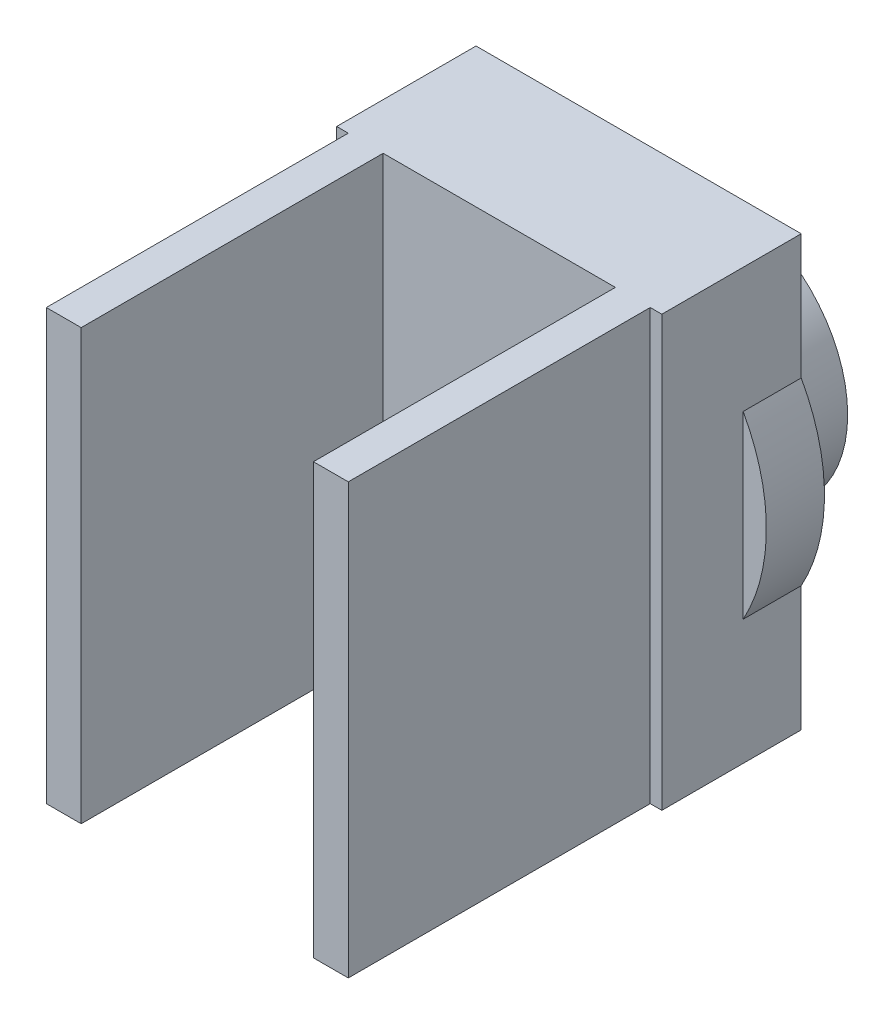
ISO-10303-21;
HEADER;
FILE_DESCRIPTION(('STEP AP214'),'2;1');
FILE_NAME('part.step','',(''),(''),'','','');
FILE_SCHEMA(('AUTOMOTIVE_DESIGN { 1 0 10303 214 1 1 1 1 }'));
ENDSEC;
DATA;
#1=APPLICATION_CONTEXT('core data for automotive mechanical design processes');
#2=APPLICATION_PROTOCOL_DEFINITION('international standard','automotive_design',2000,#1);
#3=PRODUCT_CONTEXT('',#1,'mechanical');
#4=PRODUCT('Part','Part','',(#3));
#5=PRODUCT_RELATED_PRODUCT_CATEGORY('part','',(#4));
#6=PRODUCT_DEFINITION_FORMATION('','',#4);
#7=PRODUCT_DEFINITION_CONTEXT('part definition',#1,'design');
#8=PRODUCT_DEFINITION('design','',#6,#7);
#9=PRODUCT_DEFINITION_SHAPE('','',#8);
#10=(LENGTH_UNIT() NAMED_UNIT(*) SI_UNIT(.MILLI.,.METRE.));
#11=(NAMED_UNIT(*) PLANE_ANGLE_UNIT() SI_UNIT($,.RADIAN.));
#12=(NAMED_UNIT(*) SI_UNIT($,.STERADIAN.) SOLID_ANGLE_UNIT());
#13=UNCERTAINTY_MEASURE_WITH_UNIT(LENGTH_MEASURE(1.E-05),#10,'distance_accuracy_value','');
#14=(GEOMETRIC_REPRESENTATION_CONTEXT(3) GLOBAL_UNCERTAINTY_ASSIGNED_CONTEXT((#13)) GLOBAL_UNIT_ASSIGNED_CONTEXT((#10,
#11,#12)) REPRESENTATION_CONTEXT('',''));
#15=CARTESIAN_POINT('',(0.,0.,0.));
#16=DIRECTION('',(0.,0.,1.));
#17=DIRECTION('',(1.,0.,0.));
#18=AXIS2_PLACEMENT_3D('',#15,#16,#17);
#19=CARTESIAN_POINT('',(0.,0.,24.));
#20=DIRECTION('',(0.,0.,-1.));
#21=DIRECTION('',(-1.,0.,0.));
#22=AXIS2_PLACEMENT_3D('',#19,#20,#21);
#23=PLANE('',#22);
#24=DIRECTION('',(0.,1.,0.));
#25=VECTOR('',#24,1.);
#26=CARTESIAN_POINT('',(-20.,0.,24.));
#27=LINE('',#26,#25);
#28=CARTESIAN_POINT('',(-20.,-37.,24.));
#29=VERTEX_POINT('',#28);
#30=CARTESIAN_POINT('',(-20.,37.,24.));
#31=VERTEX_POINT('',#30);
#32=EDGE_CURVE('E180',#29,#31,#27,.T.);
#33=ORIENTED_EDGE('',*,*,#32,.F.);
#34=DIRECTION('',(1.,0.,0.));
#35=VECTOR('',#34,1.);
#36=CARTESIAN_POINT('',(-28.,-37.,24.));
#37=LINE('',#36,#35);
#38=CARTESIAN_POINT('',(20.,-37.,24.));
#39=VERTEX_POINT('',#38);
#40=EDGE_CURVE('E171',#29,#39,#37,.T.);
#41=ORIENTED_EDGE('',*,*,#40,.T.);
#42=DIRECTION('',(0.,-1.,0.));
#43=VECTOR('',#42,1.);
#44=CARTESIAN_POINT('',(20.,0.,24.));
#45=LINE('',#44,#43);
#46=CARTESIAN_POINT('',(20.,37.,24.));
#47=VERTEX_POINT('',#46);
#48=EDGE_CURVE('E49',#47,#39,#45,.T.);
#49=ORIENTED_EDGE('',*,*,#48,.F.);
#50=DIRECTION('',(-1.,0.,0.));
#51=VECTOR('',#50,1.);
#52=CARTESIAN_POINT('',(-28.,37.,24.));
#53=LINE('',#52,#51);
#54=EDGE_CURVE('E64',#47,#31,#53,.T.);
#55=ORIENTED_EDGE('',*,*,#54,.T.);
#56=EDGE_LOOP('',(#33,#41,#49,#55));
#57=FACE_BOUND('',#56,.T.);
#58=ADVANCED_FACE('F41',(#57),#23,.F.);
#59=DIRECTION('',(0.,-1.,0.));
#60=VECTOR('',#59,1.);
#61=CARTESIAN_POINT('',(-26.,0.,24.));
#62=LINE('',#61,#60);
#63=CARTESIAN_POINT('',(-26.,37.,24.));
#64=VERTEX_POINT('',#63);
#65=CARTESIAN_POINT('',(-26.,-37.,24.));
#66=VERTEX_POINT('',#65);
#67=EDGE_CURVE('E56',#64,#66,#62,.T.);
#68=ORIENTED_EDGE('',*,*,#67,.F.);
#69=CARTESIAN_POINT('',(-28.,37.,24.));
#70=VERTEX_POINT('',#69);
#71=EDGE_CURVE('E210',#64,#70,#53,.T.);
#72=ORIENTED_EDGE('',*,*,#71,.T.);
#73=DIRECTION('',(0.,-1.,0.));
#74=VECTOR('',#73,1.);
#75=CARTESIAN_POINT('',(-28.,-37.,24.));
#76=LINE('',#75,#74);
#77=CARTESIAN_POINT('',(-28.,-37.,24.));
#78=VERTEX_POINT('',#77);
#79=EDGE_CURVE('E214',#70,#78,#76,.T.);
#80=ORIENTED_EDGE('',*,*,#79,.T.);
#81=EDGE_CURVE('E217',#78,#66,#37,.T.);
#82=ORIENTED_EDGE('',*,*,#81,.T.);
#83=EDGE_LOOP('',(#68,#72,#80,#82));
#84=FACE_BOUND('',#83,.T.);
#85=ADVANCED_FACE('F281',(#84),#23,.F.);
#86=DIRECTION('',(0.,1.,0.));
#87=VECTOR('',#86,1.);
#88=CARTESIAN_POINT('',(26.,0.,24.));
#89=LINE('',#88,#87);
#90=CARTESIAN_POINT('',(26.,-37.,24.));
#91=VERTEX_POINT('',#90);
#92=CARTESIAN_POINT('',(26.,37.,24.));
#93=VERTEX_POINT('',#92);
#94=EDGE_CURVE('E11',#91,#93,#89,.T.);
#95=ORIENTED_EDGE('',*,*,#94,.F.);
#96=CARTESIAN_POINT('',(28.,-37.,24.));
#97=VERTEX_POINT('',#96);
#98=EDGE_CURVE('E216',#91,#97,#37,.T.);
#99=ORIENTED_EDGE('',*,*,#98,.T.);
#100=DIRECTION('',(0.,1.,0.));
#101=VECTOR('',#100,1.);
#102=CARTESIAN_POINT('',(28.,-37.,24.));
#103=LINE('',#102,#101);
#104=CARTESIAN_POINT('',(28.,37.,24.));
#105=VERTEX_POINT('',#104);
#106=EDGE_CURVE('E207',#97,#105,#103,.T.);
#107=ORIENTED_EDGE('',*,*,#106,.T.);
#108=EDGE_CURVE('E212',#105,#93,#53,.T.);
#109=ORIENTED_EDGE('',*,*,#108,.T.);
#110=EDGE_LOOP('',(#95,#99,#107,#109));
#111=FACE_BOUND('',#110,.T.);
#112=ADVANCED_FACE('F309',(#111),#23,.F.);
#113=CARTESIAN_POINT('',(0.,0.,10.));
#114=DIRECTION('',(0.,0.,-1.));
#115=DIRECTION('',(-1.,0.,0.));
#116=AXIS2_PLACEMENT_3D('',#113,#114,#115);
#117=CYLINDRICAL_SURFACE('',#116,32.);
#118=DIRECTION('',(0.,0.,-1.));
#119=VECTOR('',#118,1.);
#120=CARTESIAN_POINT('',(28.,15.4919333848297,10.));
#121=LINE('',#120,#119);
#122=CARTESIAN_POINT('',(28.,15.4919333848297,10.));
#123=VERTEX_POINT('',#122);
#124=CARTESIAN_POINT('',(28.,15.4919333848297,0.));
#125=VERTEX_POINT('',#124);
#126=EDGE_CURVE('E251',#123,#125,#121,.T.);
#127=ORIENTED_EDGE('',*,*,#126,.F.);
#128=CARTESIAN_POINT('',(0.,0.,10.));
#129=DIRECTION('',(0.,0.,1.));
#130=DIRECTION('',(1.,0.,0.));
#131=AXIS2_PLACEMENT_3D('',#128,#129,#130);
#132=CIRCLE('',#131,32.);
#133=CARTESIAN_POINT('',(28.,-15.4919333848297,10.));
#134=VERTEX_POINT('',#133);
#135=EDGE_CURVE('E254',#134,#123,#132,.T.);
#136=ORIENTED_EDGE('',*,*,#135,.F.);
#137=DIRECTION('',(0.,0.,-1.));
#138=VECTOR('',#137,1.);
#139=CARTESIAN_POINT('',(28.,-15.4919333848297,10.));
#140=LINE('',#139,#138);
#141=CARTESIAN_POINT('',(28.,-15.4919333848297,0.));
#142=VERTEX_POINT('',#141);
#143=EDGE_CURVE('E249',#142,#134,#140,.F.);
#144=ORIENTED_EDGE('',*,*,#143,.F.);
#145=CARTESIAN_POINT('',(0.,0.,0.));
#146=DIRECTION('',(0.,0.,1.));
#147=DIRECTION('',(1.,0.,0.));
#148=AXIS2_PLACEMENT_3D('',#145,#146,#147);
#149=CIRCLE('',#148,32.);
#150=EDGE_CURVE('E253',#142,#125,#149,.T.);
#151=ORIENTED_EDGE('',*,*,#150,.T.);
#152=EDGE_LOOP('',(#127,#136,#144,#151));
#153=FACE_BOUND('',#152,.T.);
#154=ADVANCED_FACE('F317',(#153),#117,.T.);
#155=DIRECTION('',(0.,0.,-1.));
#156=VECTOR('',#155,1.);
#157=CARTESIAN_POINT('',(-28.,-15.4919333848297,10.));
#158=LINE('',#157,#156);
#159=CARTESIAN_POINT('',(-28.,-15.4919333848297,10.));
#160=VERTEX_POINT('',#159);
#161=CARTESIAN_POINT('',(-28.,-15.4919333848297,0.));
#162=VERTEX_POINT('',#161);
#163=EDGE_CURVE('E244',#160,#162,#158,.T.);
#164=ORIENTED_EDGE('',*,*,#163,.F.);
#165=CARTESIAN_POINT('',(-28.,15.4919333848297,10.));
#166=VERTEX_POINT('',#165);
#167=EDGE_CURVE('E257',#166,#160,#132,.T.);
#168=ORIENTED_EDGE('',*,*,#167,.F.);
#169=DIRECTION('',(0.,0.,-1.));
#170=VECTOR('',#169,1.);
#171=CARTESIAN_POINT('',(-28.,15.4919333848297,10.));
#172=LINE('',#171,#170);
#173=CARTESIAN_POINT('',(-28.,15.4919333848297,0.));
#174=VERTEX_POINT('',#173);
#175=EDGE_CURVE('E242',#174,#166,#172,.F.);
#176=ORIENTED_EDGE('',*,*,#175,.F.);
#177=EDGE_CURVE('E258',#174,#162,#149,.T.);
#178=ORIENTED_EDGE('',*,*,#177,.T.);
#179=EDGE_LOOP('',(#164,#168,#176,#178));
#180=FACE_BOUND('',#179,.T.);
#181=ADVANCED_FACE('F323',(#180),#117,.T.);
#182=CARTESIAN_POINT('',(0.,0.,10.));
#183=DIRECTION('',(0.,0.,1.));
#184=DIRECTION('',(1.,0.,0.));
#185=AXIS2_PLACEMENT_3D('',#182,#183,#184);
#186=PLANE('',#185);
#187=ORIENTED_EDGE('',*,*,#135,.T.);
#188=DIRECTION('',(0.,-1.,0.));
#189=VECTOR('',#188,1.);
#190=CARTESIAN_POINT('',(28.,0.,10.));
#191=LINE('',#190,#189);
#192=EDGE_CURVE('E246',#123,#134,#191,.T.);
#193=ORIENTED_EDGE('',*,*,#192,.T.);
#194=EDGE_LOOP('',(#187,#193));
#195=FACE_BOUND('',#194,.T.);
#196=ADVANCED_FACE('F352',(#195),#186,.T.);
#197=ORIENTED_EDGE('',*,*,#167,.T.);
#198=DIRECTION('',(0.,1.,0.));
#199=VECTOR('',#198,1.);
#200=CARTESIAN_POINT('',(-28.,0.,10.));
#201=LINE('',#200,#199);
#202=EDGE_CURVE('E239',#160,#166,#201,.T.);
#203=ORIENTED_EDGE('',*,*,#202,.T.);
#204=EDGE_LOOP('',(#197,#203));
#205=FACE_BOUND('',#204,.T.);
#206=ADVANCED_FACE('F347',(#205),#186,.T.);
#207=CARTESIAN_POINT('',(0.,0.,-14.));
#208=DIRECTION('',(0.,0.,1.));
#209=DIRECTION('',(1.,0.,0.));
#210=AXIS2_PLACEMENT_3D('',#207,#208,#209);
#211=CYLINDRICAL_SURFACE('',#210,22.);
#212=CARTESIAN_POINT('',(0.,0.,-14.));
#213=DIRECTION('',(0.,0.,1.));
#214=DIRECTION('',(1.,0.,0.));
#215=AXIS2_PLACEMENT_3D('',#212,#213,#214);
#216=CIRCLE('',#215,22.);
#217=CARTESIAN_POINT('',(22.,0.,-14.));
#218=VERTEX_POINT('',#217);
#219=EDGE_CURVE('E261',#218,#218,#216,.T.);
#220=ORIENTED_EDGE('',*,*,#219,.T.);
#221=EDGE_LOOP('',(#220));
#222=FACE_BOUND('',#221,.T.);
#223=CARTESIAN_POINT('',(0.,0.,0.));
#224=DIRECTION('',(0.,0.,1.));
#225=DIRECTION('',(1.,0.,0.));
#226=AXIS2_PLACEMENT_3D('',#223,#224,#225);
#227=CIRCLE('',#226,22.);
#228=CARTESIAN_POINT('',(22.,0.,0.));
#229=VERTEX_POINT('',#228);
#230=EDGE_CURVE('E264',#229,#229,#227,.T.);
#231=ORIENTED_EDGE('',*,*,#230,.F.);
#232=EDGE_LOOP('',(#231));
#233=FACE_BOUND('',#232,.T.);
#234=ADVANCED_FACE('F43',(#222,#233),#211,.T.);
#235=CARTESIAN_POINT('',(0.,0.,-14.));
#236=DIRECTION('',(0.,0.,1.));
#237=DIRECTION('',(1.,0.,0.));
#238=AXIS2_PLACEMENT_3D('',#235,#236,#237);
#239=PLANE('',#238);
#240=ORIENTED_EDGE('',*,*,#219,.F.);
#241=EDGE_LOOP('',(#240));
#242=FACE_BOUND('',#241,.T.);
#243=ADVANCED_FACE('F363',(#242),#239,.F.);
#244=CARTESIAN_POINT('',(0.,0.,0.));
#245=DIRECTION('',(0.,0.,1.));
#246=DIRECTION('',(1.,0.,0.));
#247=AXIS2_PLACEMENT_3D('',#244,#245,#246);
#248=PLANE('',#247);
#249=ORIENTED_EDGE('',*,*,#230,.T.);
#250=EDGE_LOOP('',(#249));
#251=FACE_BOUND('',#250,.T.);
#252=DIRECTION('',(0.,-1.,0.));
#253=VECTOR('',#252,1.);
#254=CARTESIAN_POINT('',(-28.,-37.,0.));
#255=LINE('',#254,#253);
#256=CARTESIAN_POINT('',(-28.,37.,0.));
#257=VERTEX_POINT('',#256);
#258=EDGE_CURVE('E225',#257,#174,#255,.T.);
#259=ORIENTED_EDGE('',*,*,#258,.F.);
#260=DIRECTION('',(-1.,0.,0.));
#261=VECTOR('',#260,1.);
#262=CARTESIAN_POINT('',(-28.,37.,0.));
#263=LINE('',#262,#261);
#264=CARTESIAN_POINT('',(28.,37.,0.));
#265=VERTEX_POINT('',#264);
#266=EDGE_CURVE('E222',#265,#257,#263,.T.);
#267=ORIENTED_EDGE('',*,*,#266,.F.);
#268=DIRECTION('',(0.,1.,0.));
#269=VECTOR('',#268,1.);
#270=CARTESIAN_POINT('',(28.,-37.,0.));
#271=LINE('',#270,#269);
#272=EDGE_CURVE('E206',#125,#265,#271,.T.);
#273=ORIENTED_EDGE('',*,*,#272,.F.);
#274=ORIENTED_EDGE('',*,*,#150,.F.);
#275=CARTESIAN_POINT('',(28.,-37.,0.));
#276=VERTEX_POINT('',#275);
#277=EDGE_CURVE('E220',#276,#142,#271,.T.);
#278=ORIENTED_EDGE('',*,*,#277,.F.);
#279=DIRECTION('',(1.,0.,0.));
#280=VECTOR('',#279,1.);
#281=CARTESIAN_POINT('',(-28.,-37.,0.));
#282=LINE('',#281,#280);
#283=CARTESIAN_POINT('',(-28.,-37.,0.));
#284=VERTEX_POINT('',#283);
#285=EDGE_CURVE('E211',#284,#276,#282,.T.);
#286=ORIENTED_EDGE('',*,*,#285,.F.);
#287=EDGE_CURVE('E224',#162,#284,#255,.T.);
#288=ORIENTED_EDGE('',*,*,#287,.F.);
#289=ORIENTED_EDGE('',*,*,#177,.F.);
#290=EDGE_LOOP('',(#259,#267,#273,#274,#278,#286,#288,#289));
#291=FACE_BOUND('',#290,.T.);
#292=ADVANCED_FACE('F338',(#251,#291),#248,.F.);
#293=CARTESIAN_POINT('',(28.,-37.,24.));
#294=DIRECTION('',(-1.,0.,0.));
#295=DIRECTION('',(0.,0.,1.));
#296=AXIS2_PLACEMENT_3D('',#293,#294,#295);
#297=PLANE('',#296);
#298=ORIENTED_EDGE('',*,*,#192,.F.);
#299=ORIENTED_EDGE('',*,*,#126,.T.);
#300=ORIENTED_EDGE('',*,*,#272,.T.);
#301=DIRECTION('',(0.,0.,-1.));
#302=VECTOR('',#301,1.);
#303=CARTESIAN_POINT('',(28.,37.,24.));
#304=LINE('',#303,#302);
#305=EDGE_CURVE('E236',#105,#265,#304,.T.);
#306=ORIENTED_EDGE('',*,*,#305,.F.);
#307=ORIENTED_EDGE('',*,*,#106,.F.);
#308=DIRECTION('',(0.,0.,-1.));
#309=VECTOR('',#308,1.);
#310=CARTESIAN_POINT('',(28.,-37.,24.));
#311=LINE('',#310,#309);
#312=EDGE_CURVE('E219',#97,#276,#311,.T.);
#313=ORIENTED_EDGE('',*,*,#312,.T.);
#314=ORIENTED_EDGE('',*,*,#277,.T.);
#315=ORIENTED_EDGE('',*,*,#143,.T.);
#316=EDGE_LOOP('',(#298,#299,#300,#306,#307,#313,#314,#315));
#317=FACE_BOUND('',#316,.T.);
#318=ADVANCED_FACE('F333',(#317),#297,.F.);
#319=CARTESIAN_POINT('',(-28.,-37.,24.));
#320=DIRECTION('',(1.,0.,0.));
#321=DIRECTION('',(0.,0.,-1.));
#322=AXIS2_PLACEMENT_3D('',#319,#320,#321);
#323=PLANE('',#322);
#324=ORIENTED_EDGE('',*,*,#202,.F.);
#325=ORIENTED_EDGE('',*,*,#163,.T.);
#326=ORIENTED_EDGE('',*,*,#287,.T.);
#327=DIRECTION('',(0.,0.,-1.));
#328=VECTOR('',#327,1.);
#329=CARTESIAN_POINT('',(-28.,-37.,24.));
#330=LINE('',#329,#328);
#331=EDGE_CURVE('E230',#78,#284,#330,.T.);
#332=ORIENTED_EDGE('',*,*,#331,.F.);
#333=ORIENTED_EDGE('',*,*,#79,.F.);
#334=DIRECTION('',(0.,0.,-1.));
#335=VECTOR('',#334,1.);
#336=CARTESIAN_POINT('',(-28.,37.,24.));
#337=LINE('',#336,#335);
#338=EDGE_CURVE('E233',#70,#257,#337,.T.);
#339=ORIENTED_EDGE('',*,*,#338,.T.);
#340=ORIENTED_EDGE('',*,*,#258,.T.);
#341=ORIENTED_EDGE('',*,*,#175,.T.);
#342=EDGE_LOOP('',(#324,#325,#326,#332,#333,#339,#340,#341));
#343=FACE_BOUND('',#342,.T.);
#344=ADVANCED_FACE('F289',(#343),#323,.F.);
#345=CARTESIAN_POINT('',(-28.,37.,24.));
#346=DIRECTION('',(0.,-1.,0.));
#347=DIRECTION('',(0.,0.,-1.));
#348=AXIS2_PLACEMENT_3D('',#345,#346,#347);
#349=PLANE('',#348);
#350=ORIENTED_EDGE('',*,*,#71,.F.);
#351=DIRECTION('',(0.,0.,-1.));
#352=VECTOR('',#351,1.);
#353=CARTESIAN_POINT('',(-26.,37.,76.));
#354=LINE('',#353,#352);
#355=CARTESIAN_POINT('',(-26.,37.,76.));
#356=VERTEX_POINT('',#355);
#357=EDGE_CURVE('E295',#356,#64,#354,.T.);
#358=ORIENTED_EDGE('',*,*,#357,.F.);
#359=DIRECTION('',(-1.,0.,0.));
#360=VECTOR('',#359,1.);
#361=CARTESIAN_POINT('',(-26.,37.,76.));
#362=LINE('',#361,#360);
#363=CARTESIAN_POINT('',(-20.,37.,76.));
#364=VERTEX_POINT('',#363);
#365=EDGE_CURVE('E178',#364,#356,#362,.T.);
#366=ORIENTED_EDGE('',*,*,#365,.F.);
#367=DIRECTION('',(0.,0.,-1.));
#368=VECTOR('',#367,1.);
#369=CARTESIAN_POINT('',(-20.,37.,76.));
#370=LINE('',#369,#368);
#371=EDGE_CURVE('E177',#364,#31,#370,.T.);
#372=ORIENTED_EDGE('',*,*,#371,.T.);
#373=ORIENTED_EDGE('',*,*,#54,.F.);
#374=DIRECTION('',(0.,0.,-1.));
#375=VECTOR('',#374,1.);
#376=CARTESIAN_POINT('',(20.,37.,76.));
#377=LINE('',#376,#375);
#378=CARTESIAN_POINT('',(20.,37.,76.));
#379=VERTEX_POINT('',#378);
#380=EDGE_CURVE('E200',#379,#47,#377,.T.);
#381=ORIENTED_EDGE('',*,*,#380,.F.);
#382=DIRECTION('',(-1.,0.,0.));
#383=VECTOR('',#382,1.);
#384=CARTESIAN_POINT('',(20.,37.,76.));
#385=LINE('',#384,#383);
#386=CARTESIAN_POINT('',(26.,37.,76.));
#387=VERTEX_POINT('',#386);
#388=EDGE_CURVE('E189',#387,#379,#385,.T.);
#389=ORIENTED_EDGE('',*,*,#388,.F.);
#390=DIRECTION('',(0.,0.,-1.));
#391=VECTOR('',#390,1.);
#392=CARTESIAN_POINT('',(26.,37.,76.));
#393=LINE('',#392,#391);
#394=EDGE_CURVE('E203',#387,#93,#393,.T.);
#395=ORIENTED_EDGE('',*,*,#394,.T.);
#396=ORIENTED_EDGE('',*,*,#108,.F.);
#397=ORIENTED_EDGE('',*,*,#305,.T.);
#398=ORIENTED_EDGE('',*,*,#266,.T.);
#399=ORIENTED_EDGE('',*,*,#338,.F.);
#400=EDGE_LOOP('',(#350,#358,#366,#372,#373,#381,#389,#395,#396,#397,#398,#399));
#401=FACE_BOUND('',#400,.T.);
#402=ADVANCED_FACE('F279',(#401),#349,.F.);
#403=CARTESIAN_POINT('',(-28.,-37.,24.));
#404=DIRECTION('',(0.,1.,0.));
#405=DIRECTION('',(0.,0.,1.));
#406=AXIS2_PLACEMENT_3D('',#403,#404,#405);
#407=PLANE('',#406);
#408=ORIENTED_EDGE('',*,*,#285,.T.);
#409=ORIENTED_EDGE('',*,*,#312,.F.);
#410=ORIENTED_EDGE('',*,*,#98,.F.);
#411=DIRECTION('',(0.,0.,-1.));
#412=VECTOR('',#411,1.);
#413=CARTESIAN_POINT('',(26.,-37.,76.));
#414=LINE('',#413,#412);
#415=CARTESIAN_POINT('',(26.,-37.,76.));
#416=VERTEX_POINT('',#415);
#417=EDGE_CURVE('E195',#416,#91,#414,.T.);
#418=ORIENTED_EDGE('',*,*,#417,.F.);
#419=DIRECTION('',(1.,0.,0.));
#420=VECTOR('',#419,1.);
#421=CARTESIAN_POINT('',(20.,-37.,76.));
#422=LINE('',#421,#420);
#423=CARTESIAN_POINT('',(20.,-37.,76.));
#424=VERTEX_POINT('',#423);
#425=EDGE_CURVE('E193',#424,#416,#422,.T.);
#426=ORIENTED_EDGE('',*,*,#425,.F.);
#427=DIRECTION('',(0.,0.,-1.));
#428=VECTOR('',#427,1.);
#429=CARTESIAN_POINT('',(20.,-37.,76.));
#430=LINE('',#429,#428);
#431=EDGE_CURVE('E198',#424,#39,#430,.T.);
#432=ORIENTED_EDGE('',*,*,#431,.T.);
#433=ORIENTED_EDGE('',*,*,#40,.F.);
#434=DIRECTION('',(0.,0.,-1.));
#435=VECTOR('',#434,1.);
#436=CARTESIAN_POINT('',(-20.,-37.,76.));
#437=LINE('',#436,#435);
#438=CARTESIAN_POINT('',(-20.,-37.,76.));
#439=VERTEX_POINT('',#438);
#440=EDGE_CURVE('E166',#439,#29,#437,.T.);
#441=ORIENTED_EDGE('',*,*,#440,.F.);
#442=DIRECTION('',(1.,0.,0.));
#443=VECTOR('',#442,1.);
#444=CARTESIAN_POINT('',(-26.,-37.,76.));
#445=LINE('',#444,#443);
#446=CARTESIAN_POINT('',(-26.,-37.,76.));
#447=VERTEX_POINT('',#446);
#448=EDGE_CURVE('E155',#447,#439,#445,.T.);
#449=ORIENTED_EDGE('',*,*,#448,.F.);
#450=DIRECTION('',(0.,0.,-1.));
#451=VECTOR('',#450,1.);
#452=CARTESIAN_POINT('',(-26.,-37.,76.));
#453=LINE('',#452,#451);
#454=EDGE_CURVE('E173',#447,#66,#453,.T.);
#455=ORIENTED_EDGE('',*,*,#454,.T.);
#456=ORIENTED_EDGE('',*,*,#81,.F.);
#457=ORIENTED_EDGE('',*,*,#331,.T.);
#458=EDGE_LOOP('',(#408,#409,#410,#418,#426,#432,#433,#441,#449,#455,#456,#457));
#459=FACE_BOUND('',#458,.T.);
#460=ADVANCED_FACE('F169',(#459),#407,.F.);
#461=CARTESIAN_POINT('',(26.,-37.,76.));
#462=DIRECTION('',(-1.,0.,0.));
#463=DIRECTION('',(0.,0.,1.));
#464=AXIS2_PLACEMENT_3D('',#461,#462,#463);
#465=PLANE('',#464);
#466=ORIENTED_EDGE('',*,*,#417,.T.);
#467=ORIENTED_EDGE('',*,*,#94,.T.);
#468=ORIENTED_EDGE('',*,*,#394,.F.);
#469=DIRECTION('',(0.,1.,0.));
#470=VECTOR('',#469,1.);
#471=CARTESIAN_POINT('',(26.,-37.,76.));
#472=LINE('',#471,#470);
#473=EDGE_CURVE('E186',#416,#387,#472,.T.);
#474=ORIENTED_EDGE('',*,*,#473,.F.);
#475=EDGE_LOOP('',(#466,#467,#468,#474));
#476=FACE_BOUND('',#475,.T.);
#477=ADVANCED_FACE('F329',(#476),#465,.F.);
#478=CARTESIAN_POINT('',(20.,-37.,76.));
#479=DIRECTION('',(1.,0.,0.));
#480=DIRECTION('',(0.,0.,-1.));
#481=AXIS2_PLACEMENT_3D('',#478,#479,#480);
#482=PLANE('',#481);
#483=ORIENTED_EDGE('',*,*,#380,.T.);
#484=ORIENTED_EDGE('',*,*,#48,.T.);
#485=ORIENTED_EDGE('',*,*,#431,.F.);
#486=DIRECTION('',(0.,-1.,0.));
#487=VECTOR('',#486,1.);
#488=CARTESIAN_POINT('',(20.,-37.,76.));
#489=LINE('',#488,#487);
#490=EDGE_CURVE('E191',#379,#424,#489,.T.);
#491=ORIENTED_EDGE('',*,*,#490,.F.);
#492=EDGE_LOOP('',(#483,#484,#485,#491));
#493=FACE_BOUND('',#492,.T.);
#494=ADVANCED_FACE('F269',(#493),#482,.F.);
#495=CARTESIAN_POINT('',(0.,0.,76.));
#496=DIRECTION('',(0.,0.,-1.));
#497=DIRECTION('',(-1.,0.,0.));
#498=AXIS2_PLACEMENT_3D('',#495,#496,#497);
#499=PLANE('',#498);
#500=ORIENTED_EDGE('',*,*,#473,.T.);
#501=ORIENTED_EDGE('',*,*,#388,.T.);
#502=ORIENTED_EDGE('',*,*,#490,.T.);
#503=ORIENTED_EDGE('',*,*,#425,.T.);
#504=EDGE_LOOP('',(#500,#501,#502,#503));
#505=FACE_BOUND('',#504,.T.);
#506=ADVANCED_FACE('F276',(#505),#499,.F.);
#507=CARTESIAN_POINT('',(-20.,-37.,76.));
#508=DIRECTION('',(-1.,0.,0.));
#509=DIRECTION('',(0.,0.,1.));
#510=AXIS2_PLACEMENT_3D('',#507,#508,#509);
#511=PLANE('',#510);
#512=ORIENTED_EDGE('',*,*,#440,.T.);
#513=ORIENTED_EDGE('',*,*,#32,.T.);
#514=ORIENTED_EDGE('',*,*,#371,.F.);
#515=DIRECTION('',(0.,1.,0.));
#516=VECTOR('',#515,1.);
#517=CARTESIAN_POINT('',(-20.,-37.,76.));
#518=LINE('',#517,#516);
#519=EDGE_CURVE('E159',#439,#364,#518,.T.);
#520=ORIENTED_EDGE('',*,*,#519,.F.);
#521=EDGE_LOOP('',(#512,#513,#514,#520));
#522=FACE_BOUND('',#521,.T.);
#523=ADVANCED_FACE('F175',(#522),#511,.F.);
#524=CARTESIAN_POINT('',(-26.,-37.,76.));
#525=DIRECTION('',(1.,0.,0.));
#526=DIRECTION('',(0.,0.,-1.));
#527=AXIS2_PLACEMENT_3D('',#524,#525,#526);
#528=PLANE('',#527);
#529=ORIENTED_EDGE('',*,*,#357,.T.);
#530=ORIENTED_EDGE('',*,*,#67,.T.);
#531=ORIENTED_EDGE('',*,*,#454,.F.);
#532=DIRECTION('',(0.,-1.,0.));
#533=VECTOR('',#532,1.);
#534=CARTESIAN_POINT('',(-26.,-37.,76.));
#535=LINE('',#534,#533);
#536=EDGE_CURVE('E162',#356,#447,#535,.T.);
#537=ORIENTED_EDGE('',*,*,#536,.F.);
#538=EDGE_LOOP('',(#529,#530,#531,#537));
#539=FACE_BOUND('',#538,.T.);
#540=ADVANCED_FACE('F294',(#539),#528,.F.);
#541=CARTESIAN_POINT('',(0.,0.,76.));
#542=DIRECTION('',(0.,0.,-1.));
#543=DIRECTION('',(-1.,0.,0.));
#544=AXIS2_PLACEMENT_3D('',#541,#542,#543);
#545=PLANE('',#544);
#546=ORIENTED_EDGE('',*,*,#519,.T.);
#547=ORIENTED_EDGE('',*,*,#365,.T.);
#548=ORIENTED_EDGE('',*,*,#536,.T.);
#549=ORIENTED_EDGE('',*,*,#448,.T.);
#550=EDGE_LOOP('',(#546,#547,#548,#549));
#551=FACE_BOUND('',#550,.T.);
#552=ADVANCED_FACE('F157',(#551),#545,.F.);
#553=CLOSED_SHELL('',(#58,#85,#112,#154,#181,#196,#206,#234,#243,#292,#318,#344,#402,#460,#477,
#494,#506,#523,#540,#552));
#554=MANIFOLD_SOLID_BREP('B2',#553);
#555=ADVANCED_BREP_SHAPE_REPRESENTATION('',(#18,#554),#14);
#556=SHAPE_DEFINITION_REPRESENTATION(#9,#555);
ENDSEC;
END-ISO-10303-21;
